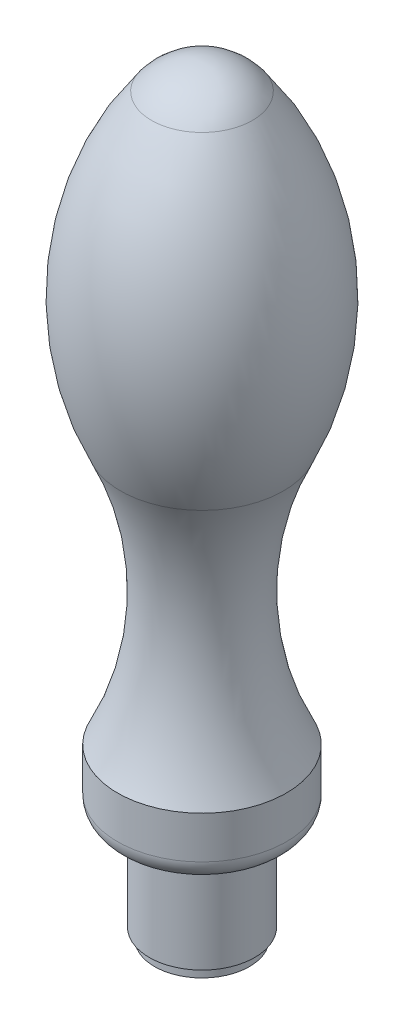
ISO-10303-21;
HEADER;
FILE_DESCRIPTION(('STEP AP214'),'2;1');
FILE_NAME('part.step','',(''),(''),'','','');
FILE_SCHEMA(('AUTOMOTIVE_DESIGN { 1 0 10303 214 1 1 1 1 }'));
ENDSEC;
DATA;
#1=APPLICATION_CONTEXT('core data for automotive mechanical design processes');
#2=APPLICATION_PROTOCOL_DEFINITION('international standard','automotive_design',2000,#1);
#3=PRODUCT_CONTEXT('',#1,'mechanical');
#4=PRODUCT('Part','Part','',(#3));
#5=PRODUCT_RELATED_PRODUCT_CATEGORY('part','',(#4));
#6=PRODUCT_DEFINITION_FORMATION('','',#4);
#7=PRODUCT_DEFINITION_CONTEXT('part definition',#1,'design');
#8=PRODUCT_DEFINITION('design','',#6,#7);
#9=PRODUCT_DEFINITION_SHAPE('','',#8);
#10=(LENGTH_UNIT() NAMED_UNIT(*) SI_UNIT(.MILLI.,.METRE.));
#11=(NAMED_UNIT(*) PLANE_ANGLE_UNIT() SI_UNIT($,.RADIAN.));
#12=(NAMED_UNIT(*) SI_UNIT($,.STERADIAN.) SOLID_ANGLE_UNIT());
#13=UNCERTAINTY_MEASURE_WITH_UNIT(LENGTH_MEASURE(1.E-05),#10,'distance_accuracy_value','');
#14=(GEOMETRIC_REPRESENTATION_CONTEXT(3) GLOBAL_UNCERTAINTY_ASSIGNED_CONTEXT((#13)) GLOBAL_UNIT_ASSIGNED_CONTEXT((#10,
#11,#12)) REPRESENTATION_CONTEXT('',''));
#15=CARTESIAN_POINT('',(0.,0.,0.));
#16=DIRECTION('',(0.,0.,1.));
#17=DIRECTION('',(1.,0.,0.));
#18=AXIS2_PLACEMENT_3D('',#15,#16,#17);
#19=CARTESIAN_POINT('',(0.,0.,0.));
#20=DIRECTION('',(0.,1.,0.));
#21=DIRECTION('',(0.,0.,1.));
#22=AXIS2_PLACEMENT_3D('',#19,#20,#21);
#23=PLANE('',#22);
#24=CARTESIAN_POINT('',(0.,0.,0.));
#25=DIRECTION('',(0.,-1.,0.));
#26=DIRECTION('',(0.,0.,-1.));
#27=AXIS2_PLACEMENT_3D('',#24,#25,#26);
#28=CIRCLE('',#27,4.5);
#29=CARTESIAN_POINT('',(0.,0.,-4.5));
#30=VERTEX_POINT('',#29);
#31=EDGE_CURVE('E10',#30,#30,#28,.T.);
#32=ORIENTED_EDGE('',*,*,#31,.T.);
#33=EDGE_LOOP('',(#32));
#34=FACE_BOUND('',#33,.T.);
#35=ADVANCED_FACE('F36',(#34),#23,.F.);
#36=CARTESIAN_POINT('',(0.,0.,0.));
#37=DIRECTION('',(0.,-1.,0.));
#38=DIRECTION('',(0.,0.,-1.));
#39=AXIS2_PLACEMENT_3D('',#36,#37,#38);
#40=CYLINDRICAL_SURFACE('',#39,4.5);
#41=ORIENTED_EDGE('',*,*,#31,.F.);
#42=EDGE_LOOP('',(#41));
#43=FACE_BOUND('',#42,.T.);
#44=CARTESIAN_POINT('',(0.,0.999999999999999,0.));
#45=DIRECTION('',(0.,-1.,0.));
#46=DIRECTION('',(0.,0.,-1.));
#47=AXIS2_PLACEMENT_3D('',#44,#45,#46);
#48=CIRCLE('',#47,4.5);
#49=CARTESIAN_POINT('',(0.,0.999999999999999,-4.5));
#50=VERTEX_POINT('',#49);
#51=EDGE_CURVE('E43',#50,#50,#48,.T.);
#52=ORIENTED_EDGE('',*,*,#51,.T.);
#53=EDGE_LOOP('',(#52));
#54=FACE_BOUND('',#53,.T.);
#55=ADVANCED_FACE('F95',(#43,#54),#40,.T.);
#56=CARTESIAN_POINT('',(-4.5,0.999999999999999,0.));
#57=DIRECTION('',(0.,1.,0.));
#58=DIRECTION('',(0.,0.,1.));
#59=AXIS2_PLACEMENT_3D('',#56,#57,#58);
#60=PLANE('',#59);
#61=ORIENTED_EDGE('',*,*,#51,.F.);
#62=EDGE_LOOP('',(#61));
#63=FACE_BOUND('',#62,.T.);
#64=CARTESIAN_POINT('',(0.,0.999999999999999,0.));
#65=DIRECTION('',(0.,-1.,0.));
#66=DIRECTION('',(0.,0.,-1.));
#67=AXIS2_PLACEMENT_3D('',#64,#65,#66);
#68=CIRCLE('',#67,5.);
#69=CARTESIAN_POINT('',(0.,0.999999999999999,-5.));
#70=VERTEX_POINT('',#69);
#71=EDGE_CURVE('E49',#70,#70,#68,.T.);
#72=ORIENTED_EDGE('',*,*,#71,.T.);
#73=EDGE_LOOP('',(#72));
#74=FACE_BOUND('',#73,.T.);
#75=ADVANCED_FACE('F99',(#63,#74),#60,.F.);
#76=CARTESIAN_POINT('',(0.,0.,0.));
#77=DIRECTION('',(0.,-1.,0.));
#78=DIRECTION('',(0.,0.,-1.));
#79=AXIS2_PLACEMENT_3D('',#76,#77,#78);
#80=CYLINDRICAL_SURFACE('',#79,5.);
#81=ORIENTED_EDGE('',*,*,#71,.F.);
#82=EDGE_LOOP('',(#81));
#83=FACE_BOUND('',#82,.T.);
#84=CARTESIAN_POINT('',(0.,10.,0.));
#85=DIRECTION('',(0.,-1.,0.));
#86=DIRECTION('',(0.,0.,-1.));
#87=AXIS2_PLACEMENT_3D('',#84,#85,#86);
#88=CIRCLE('',#87,5.);
#89=CARTESIAN_POINT('',(0.,10.,-5.));
#90=VERTEX_POINT('',#89);
#91=EDGE_CURVE('E55',#90,#90,#88,.T.);
#92=ORIENTED_EDGE('',*,*,#91,.T.);
#93=EDGE_LOOP('',(#92));
#94=FACE_BOUND('',#93,.T.);
#95=ADVANCED_FACE('F104',(#83,#94),#80,.T.);
#96=CARTESIAN_POINT('',(-5.,10.,0.));
#97=DIRECTION('',(0.,1.,0.));
#98=DIRECTION('',(0.,0.,1.));
#99=AXIS2_PLACEMENT_3D('',#96,#97,#98);
#100=PLANE('',#99);
#101=ORIENTED_EDGE('',*,*,#91,.F.);
#102=EDGE_LOOP('',(#101));
#103=FACE_BOUND('',#102,.T.);
#104=CARTESIAN_POINT('',(0.,10.,0.));
#105=DIRECTION('',(0.,-1.,0.));
#106=DIRECTION('',(0.,0.,-1.));
#107=AXIS2_PLACEMENT_3D('',#104,#105,#106);
#108=CIRCLE('',#107,5.99999999999999);
#109=CARTESIAN_POINT('',(0.,10.,-5.99999999999999));
#110=VERTEX_POINT('',#109);
#111=EDGE_CURVE('E61',#110,#110,#108,.T.);
#112=ORIENTED_EDGE('',*,*,#111,.T.);
#113=EDGE_LOOP('',(#112));
#114=FACE_BOUND('',#113,.T.);
#115=ADVANCED_FACE('F110',(#103,#114),#100,.F.);
#116=CARTESIAN_POINT('',(0.,12.,0.));
#117=DIRECTION('',(0.,-1.,0.));
#118=DIRECTION('',(0.,0.,-1.));
#119=AXIS2_PLACEMENT_3D('',#116,#117,#118);
#120=TOROIDAL_SURFACE('',#119,6.,2.);
#121=ORIENTED_EDGE('',*,*,#111,.F.);
#122=EDGE_LOOP('',(#121));
#123=FACE_BOUND('',#122,.T.);
#124=CARTESIAN_POINT('',(0.,12.,0.));
#125=DIRECTION('',(0.,-1.,0.));
#126=DIRECTION('',(0.,0.,-1.));
#127=AXIS2_PLACEMENT_3D('',#124,#125,#126);
#128=CIRCLE('',#127,8.);
#129=CARTESIAN_POINT('',(0.,12.,-8.));
#130=VERTEX_POINT('',#129);
#131=EDGE_CURVE('E65',#130,#130,#128,.T.);
#132=ORIENTED_EDGE('',*,*,#131,.T.);
#133=EDGE_LOOP('',(#132));
#134=FACE_BOUND('',#133,.T.);
#135=ADVANCED_FACE('F114',(#123,#134),#120,.T.);
#136=CARTESIAN_POINT('',(0.,0.,0.));
#137=DIRECTION('',(0.,-1.,0.));
#138=DIRECTION('',(0.,0.,-1.));
#139=AXIS2_PLACEMENT_3D('',#136,#137,#138);
#140=CYLINDRICAL_SURFACE('',#139,8.);
#141=ORIENTED_EDGE('',*,*,#131,.F.);
#142=EDGE_LOOP('',(#141));
#143=FACE_BOUND('',#142,.T.);
#144=CARTESIAN_POINT('',(0.,16.,0.));
#145=DIRECTION('',(0.,-1.,0.));
#146=DIRECTION('',(0.,0.,-1.));
#147=AXIS2_PLACEMENT_3D('',#144,#145,#146);
#148=CIRCLE('',#147,8.);
#149=CARTESIAN_POINT('',(0.,16.,-8.));
#150=VERTEX_POINT('',#149);
#151=EDGE_CURVE('E69',#150,#150,#148,.T.);
#152=ORIENTED_EDGE('',*,*,#151,.T.);
#153=EDGE_LOOP('',(#152));
#154=FACE_BOUND('',#153,.T.);
#155=ADVANCED_FACE('F118',(#143,#154),#140,.T.);
#156=CARTESIAN_POINT('',(0.,28.612918956564,0.));
#157=DIRECTION('',(0.,-1.,0.));
#158=DIRECTION('',(0.,0.,-1.));
#159=AXIS2_PLACEMENT_3D('',#156,#157,#158);
#160=TOROIDAL_SURFACE('',#159,32.9982854491093,28.);
#161=ORIENTED_EDGE('',*,*,#151,.F.);
#162=EDGE_LOOP('',(#161));
#163=FACE_BOUND('',#162,.T.);
#164=CARTESIAN_POINT('',(0.,40.6695028234232,0.));
#165=DIRECTION('',(0.,-1.,0.));
#166=DIRECTION('',(0.,0.,-1.));
#167=AXIS2_PLACEMENT_3D('',#164,#165,#166);
#168=CIRCLE('',#167,7.72698185270982);
#169=CARTESIAN_POINT('',(0.,40.6695028234232,-7.72698185270982));
#170=VERTEX_POINT('',#169);
#171=EDGE_CURVE('E73',#170,#170,#168,.T.);
#172=ORIENTED_EDGE('',*,*,#171,.T.);
#173=EDGE_LOOP('',(#172));
#174=FACE_BOUND('',#173,.T.);
#175=ADVANCED_FACE('F91',(#163,#174),#160,.F.);
#176=CARTESIAN_POINT('',(0.,52.7260866902823,0.));
#177=DIRECTION('',(0.,-1.,0.));
#178=DIRECTION('',(0.,0.,-1.));
#179=AXIS2_PLACEMENT_3D('',#176,#177,#178);
#180=DEGENERATE_TOROIDAL_SURFACE('',#179,17.5443217436896,28.,.F.);
#181=ORIENTED_EDGE('',*,*,#171,.F.);
#182=EDGE_LOOP('',(#181));
#183=FACE_BOUND('',#182,.T.);
#184=CARTESIAN_POINT('',(0.,69.6201581753775,0.));
#185=DIRECTION('',(0.,-1.,0.));
#186=DIRECTION('',(0.,0.,-1.));
#187=AXIS2_PLACEMENT_3D('',#184,#185,#186);
#188=CIRCLE('',#187,4.78481502100626);
#189=CARTESIAN_POINT('',(0.,69.6201581753775,-4.78481502100626));
#190=VERTEX_POINT('',#189);
#191=EDGE_CURVE('E77',#190,#190,#188,.T.);
#192=ORIENTED_EDGE('',*,*,#191,.T.);
#193=EDGE_LOOP('',(#192));
#194=FACE_BOUND('',#193,.T.);
#195=ADVANCED_FACE('F83',(#183,#194),#180,.F.);
#196=CARTESIAN_POINT('',(0.,66.,0.));
#197=DIRECTION('',(0.,-1.,0.));
#198=DIRECTION('',(-1.,0.,0.));
#199=AXIS2_PLACEMENT_3D('',#196,#197,#198);
#200=SPHERICAL_SURFACE('',#199,6.00000000000001);
#201=ORIENTED_EDGE('',*,*,#191,.F.);
#202=EDGE_LOOP('',(#201));
#203=FACE_BOUND('',#202,.T.);
#204=ADVANCED_FACE('F85',(#203),#200,.T.);
#205=CLOSED_SHELL('',(#35,#55,#75,#95,#115,#135,#155,#175,#195,#204));
#206=MANIFOLD_SOLID_BREP('B2',#205);
#207=ADVANCED_BREP_SHAPE_REPRESENTATION('',(#18,#206),#14);
#208=SHAPE_DEFINITION_REPRESENTATION(#9,#207);
ENDSEC;
END-ISO-10303-21;
